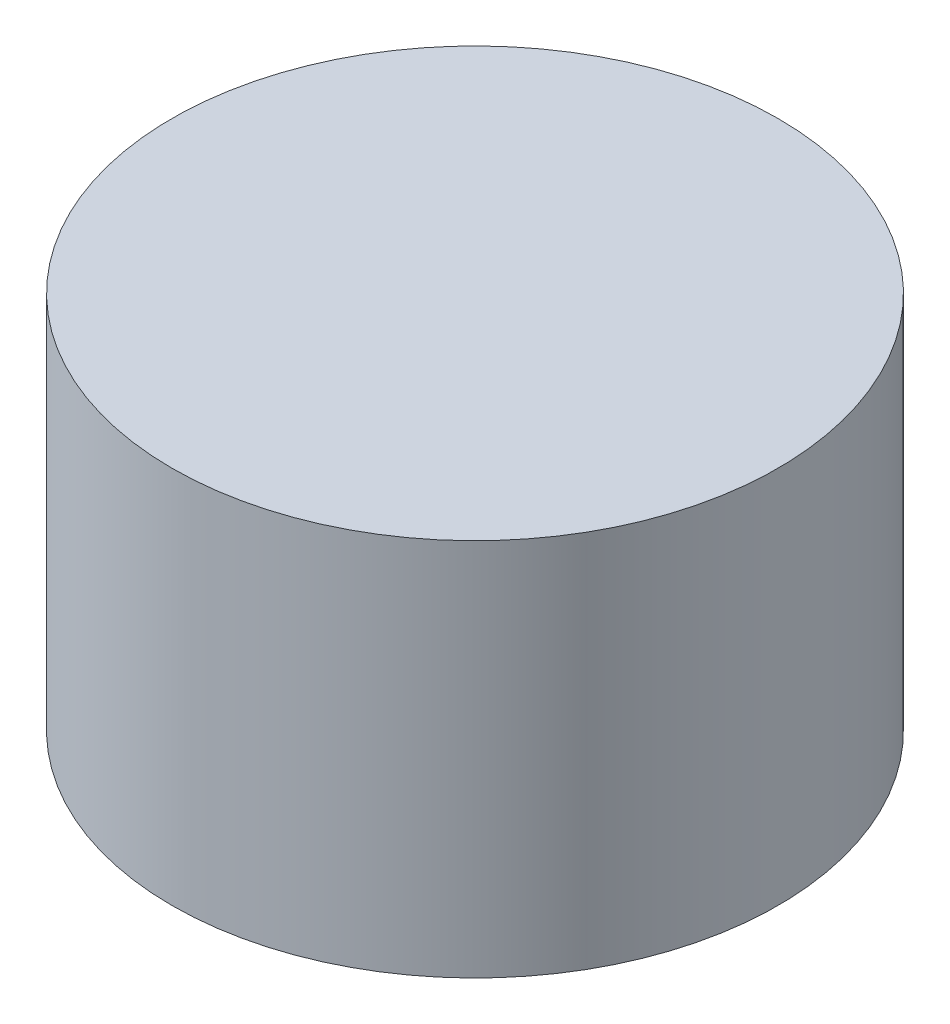
ISO-10303-21;
HEADER;
FILE_DESCRIPTION(('STEP AP214'),'2;1');
FILE_NAME('part.step','',(''),(''),'','','');
FILE_SCHEMA(('AUTOMOTIVE_DESIGN { 1 0 10303 214 1 1 1 1 }'));
ENDSEC;
DATA;
#1=APPLICATION_CONTEXT('core data for automotive mechanical design processes');
#2=APPLICATION_PROTOCOL_DEFINITION('international standard','automotive_design',2000,#1);
#3=PRODUCT_CONTEXT('',#1,'mechanical');
#4=PRODUCT('Part','Part','',(#3));
#5=PRODUCT_RELATED_PRODUCT_CATEGORY('part','',(#4));
#6=PRODUCT_DEFINITION_FORMATION('','',#4);
#7=PRODUCT_DEFINITION_CONTEXT('part definition',#1,'design');
#8=PRODUCT_DEFINITION('design','',#6,#7);
#9=PRODUCT_DEFINITION_SHAPE('','',#8);
#10=(LENGTH_UNIT() NAMED_UNIT(*) SI_UNIT(.MILLI.,.METRE.));
#11=(NAMED_UNIT(*) PLANE_ANGLE_UNIT() SI_UNIT($,.RADIAN.));
#12=(NAMED_UNIT(*) SI_UNIT($,.STERADIAN.) SOLID_ANGLE_UNIT());
#13=UNCERTAINTY_MEASURE_WITH_UNIT(LENGTH_MEASURE(1.E-05),#10,'distance_accuracy_value','');
#14=(GEOMETRIC_REPRESENTATION_CONTEXT(3) GLOBAL_UNCERTAINTY_ASSIGNED_CONTEXT((#13)) GLOBAL_UNIT_ASSIGNED_CONTEXT((#10,
#11,#12)) REPRESENTATION_CONTEXT('',''));
#15=CARTESIAN_POINT('',(0.,0.,0.));
#16=DIRECTION('',(0.,0.,1.));
#17=DIRECTION('',(1.,0.,0.));
#18=AXIS2_PLACEMENT_3D('',#15,#16,#17);
#19=CARTESIAN_POINT('',(0.,25.4,0.));
#20=DIRECTION('',(0.,-1.,0.));
#21=DIRECTION('',(0.,0.,-1.));
#22=AXIS2_PLACEMENT_3D('',#19,#20,#21);
#23=CYLINDRICAL_SURFACE('',#22,20.32);
#24=CARTESIAN_POINT('',(0.,25.4,0.));
#25=DIRECTION('',(0.,1.,0.));
#26=DIRECTION('',(0.,0.,1.));
#27=AXIS2_PLACEMENT_3D('',#24,#25,#26);
#28=CIRCLE('',#27,20.32);
#29=CARTESIAN_POINT('',(0.,25.4,20.32));
#30=VERTEX_POINT('',#29);
#31=EDGE_CURVE('E10',#30,#30,#28,.T.);
#32=ORIENTED_EDGE('',*,*,#31,.F.);
#33=EDGE_LOOP('',(#32));
#34=FACE_BOUND('',#33,.T.);
#35=CARTESIAN_POINT('',(0.,0.,0.));
#36=DIRECTION('',(0.,1.,0.));
#37=DIRECTION('',(0.,0.,1.));
#38=AXIS2_PLACEMENT_3D('',#35,#36,#37);
#39=CIRCLE('',#38,20.32);
#40=CARTESIAN_POINT('',(0.,0.,20.32));
#41=VERTEX_POINT('',#40);
#42=EDGE_CURVE('E40',#41,#41,#39,.T.);
#43=ORIENTED_EDGE('',*,*,#42,.T.);
#44=EDGE_LOOP('',(#43));
#45=FACE_BOUND('',#44,.T.);
#46=ADVANCED_FACE('F37',(#34,#45),#23,.T.);
#47=CARTESIAN_POINT('',(0.,25.4,0.));
#48=DIRECTION('',(0.,1.,0.));
#49=DIRECTION('',(0.,0.,1.));
#50=AXIS2_PLACEMENT_3D('',#47,#48,#49);
#51=PLANE('',#50);
#52=ORIENTED_EDGE('',*,*,#31,.T.);
#53=EDGE_LOOP('',(#52));
#54=FACE_BOUND('',#53,.T.);
#55=ADVANCED_FACE('F70',(#54),#51,.T.);
#56=CARTESIAN_POINT('',(0.,0.,0.));
#57=DIRECTION('',(0.,1.,0.));
#58=DIRECTION('',(0.,0.,1.));
#59=AXIS2_PLACEMENT_3D('',#56,#57,#58);
#60=PLANE('',#59);
#61=CARTESIAN_POINT('',(0.,0.,0.));
#62=DIRECTION('',(0.,-1.,0.));
#63=DIRECTION('',(0.,0.,-1.));
#64=AXIS2_PLACEMENT_3D('',#61,#62,#63);
#65=CIRCLE('',#64,16.51);
#66=CARTESIAN_POINT('',(0.,0.,-16.51));
#67=VERTEX_POINT('',#66);
#68=EDGE_CURVE('E51',#67,#67,#65,.T.);
#69=ORIENTED_EDGE('',*,*,#68,.F.);
#70=EDGE_LOOP('',(#69));
#71=FACE_BOUND('',#70,.T.);
#72=ORIENTED_EDGE('',*,*,#42,.F.);
#73=EDGE_LOOP('',(#72));
#74=FACE_BOUND('',#73,.T.);
#75=ADVANCED_FACE('F64',(#71,#74),#60,.F.);
#76=CARTESIAN_POINT('',(0.,15.24,0.));
#77=DIRECTION('',(0.,-1.,0.));
#78=DIRECTION('',(0.,0.,-1.));
#79=AXIS2_PLACEMENT_3D('',#76,#77,#78);
#80=CYLINDRICAL_SURFACE('',#79,16.51);
#81=CARTESIAN_POINT('',(0.,15.24,0.));
#82=DIRECTION('',(0.,-1.,0.));
#83=DIRECTION('',(0.,0.,-1.));
#84=AXIS2_PLACEMENT_3D('',#81,#82,#83);
#85=CIRCLE('',#84,16.51);
#86=CARTESIAN_POINT('',(0.,15.24,-16.51));
#87=VERTEX_POINT('',#86);
#88=EDGE_CURVE('E49',#87,#87,#85,.T.);
#89=CARTESIAN_POINT('',(0.,15.24,-16.51));
#90=CARTESIAN_POINT('',(0.,15.08125,-16.51));
#91=CARTESIAN_POINT('',(0.,14.9225,-16.51));
#92=CARTESIAN_POINT('',(0.,14.605,-16.51));
#93=CARTESIAN_POINT('',(0.,14.44625,-16.51));
#94=CARTESIAN_POINT('',(0.,14.12875,-16.51));
#95=CARTESIAN_POINT('',(0.,13.97,-16.51));
#96=CARTESIAN_POINT('',(0.,13.6525,-16.51));
#97=CARTESIAN_POINT('',(0.,13.49375,-16.51));
#98=CARTESIAN_POINT('',(0.,13.17625,-16.51));
#99=CARTESIAN_POINT('',(0.,13.0175,-16.51));
#100=CARTESIAN_POINT('',(0.,12.7,-16.51));
#101=CARTESIAN_POINT('',(0.,12.54125,-16.51));
#102=CARTESIAN_POINT('',(0.,12.22375,-16.51));
#103=CARTESIAN_POINT('',(0.,12.065,-16.51));
#104=CARTESIAN_POINT('',(0.,11.7475,-16.51));
#105=CARTESIAN_POINT('',(0.,11.58875,-16.51));
#106=CARTESIAN_POINT('',(0.,11.27125,-16.51));
#107=CARTESIAN_POINT('',(0.,11.1125,-16.51));
#108=CARTESIAN_POINT('',(0.,10.795,-16.51));
#109=CARTESIAN_POINT('',(0.,10.63625,-16.51));
#110=CARTESIAN_POINT('',(0.,10.31875,-16.51));
#111=CARTESIAN_POINT('',(0.,10.16,-16.51));
#112=CARTESIAN_POINT('',(0.,9.8425,-16.51));
#113=CARTESIAN_POINT('',(0.,9.68375,-16.51));
#114=CARTESIAN_POINT('',(0.,9.36625,-16.51));
#115=CARTESIAN_POINT('',(0.,9.2075,-16.51));
#116=CARTESIAN_POINT('',(0.,8.89,-16.51));
#117=CARTESIAN_POINT('',(0.,8.73125,-16.51));
#118=CARTESIAN_POINT('',(0.,8.41375,-16.51));
#119=CARTESIAN_POINT('',(0.,8.255,-16.51));
#120=CARTESIAN_POINT('',(0.,7.9375,-16.51));
#121=CARTESIAN_POINT('',(0.,7.77875,-16.51));
#122=CARTESIAN_POINT('',(0.,7.46125,-16.51));
#123=CARTESIAN_POINT('',(0.,7.3025,-16.51));
#124=CARTESIAN_POINT('',(0.,6.985,-16.51));
#125=CARTESIAN_POINT('',(0.,6.82625,-16.51));
#126=CARTESIAN_POINT('',(0.,6.50875,-16.51));
#127=CARTESIAN_POINT('',(0.,6.35,-16.51));
#128=CARTESIAN_POINT('',(0.,6.0325,-16.51));
#129=CARTESIAN_POINT('',(0.,5.87375,-16.51));
#130=CARTESIAN_POINT('',(0.,5.55625,-16.51));
#131=CARTESIAN_POINT('',(0.,5.3975,-16.51));
#132=CARTESIAN_POINT('',(0.,5.08,-16.51));
#133=CARTESIAN_POINT('',(0.,4.92125,-16.51));
#134=CARTESIAN_POINT('',(0.,4.60375,-16.51));
#135=CARTESIAN_POINT('',(0.,4.445,-16.51));
#136=CARTESIAN_POINT('',(0.,4.1275,-16.51));
#137=CARTESIAN_POINT('',(0.,3.96875,-16.51));
#138=CARTESIAN_POINT('',(0.,3.65125,-16.51));
#139=CARTESIAN_POINT('',(0.,3.4925,-16.51));
#140=CARTESIAN_POINT('',(0.,3.175,-16.51));
#141=CARTESIAN_POINT('',(0.,3.01625,-16.51));
#142=CARTESIAN_POINT('',(0.,2.69875,-16.51));
#143=CARTESIAN_POINT('',(0.,2.54,-16.51));
#144=CARTESIAN_POINT('',(0.,2.2225,-16.51));
#145=CARTESIAN_POINT('',(0.,2.06375,-16.51));
#146=CARTESIAN_POINT('',(0.,1.74625,-16.51));
#147=CARTESIAN_POINT('',(0.,1.5875,-16.51));
#148=CARTESIAN_POINT('',(0.,1.27,-16.51));
#149=CARTESIAN_POINT('',(0.,1.11125,-16.51));
#150=CARTESIAN_POINT('',(0.,0.79375,-16.51));
#151=CARTESIAN_POINT('',(0.,0.634999999999999,-16.51));
#152=CARTESIAN_POINT('',(0.,0.3175,-16.51));
#153=CARTESIAN_POINT('',(0.,0.15875,-16.51));
#154=CARTESIAN_POINT('',(0.,0.,-16.51));
#155=B_SPLINE_CURVE_WITH_KNOTS('',3,(#89,#90,#91,#92,#93,#94,#95,#96,#97,#98,#99,#100,#101,#102,
#103,#104,#105,#106,#107,#108,#109,#110,#111,#112,#113,#114,#115,#116,#117,#118,#119,#120,#121,
#122,#123,#124,#125,#126,#127,#128,#129,#130,#131,#132,#133,#134,#135,#136,#137,#138,#139,#140,
#141,#142,#143,#144,#145,#146,#147,#148,#149,#150,#151,#152,#153,#154),.UNSPECIFIED.,.F.,.F.,(4,
2,2,2,2,2,2,2,2,2,2,2,2,2,2,2,2,2,2,2,2,2,2,2,2,2,2,2,2,2,2,2,4),(0.,0.476249999999999,
0.952499999999998,1.42875,1.905,2.38125,2.8575,3.33375,3.81,4.28625,4.7625,5.23875,5.715,
6.19125,6.6675,7.14375,7.62,8.09625,8.5725,9.04875,9.525,10.00125,10.4775,10.95375,11.43,
11.90625,12.3825,12.85875,13.335,13.81125,14.2875,14.76375,15.24),.UNSPECIFIED.);
#156=EDGE_CURVE('BSEAM61',#87,#67,#155,.T.);
#157=ORIENTED_EDGE('',*,*,#88,.F.);
#158=ORIENTED_EDGE('',*,*,#68,.T.);
#159=ORIENTED_EDGE('',*,*,#156,.T.);
#160=ORIENTED_EDGE('',*,*,#156,.F.);
#161=EDGE_LOOP('',(#157,#159,#158,#160));
#162=FACE_BOUND('',#161,.T.);
#163=ADVANCED_FACE('F61',(#162),#80,.F.);
#164=CARTESIAN_POINT('',(0.,15.24,0.));
#165=DIRECTION('',(0.,-1.,0.));
#166=DIRECTION('',(0.,0.,-1.));
#167=AXIS2_PLACEMENT_3D('',#164,#165,#166);
#168=PLANE('',#167);
#169=ORIENTED_EDGE('',*,*,#88,.T.);
#170=EDGE_LOOP('',(#169));
#171=FACE_BOUND('',#170,.T.);
#172=ADVANCED_FACE('F59',(#171),#168,.T.);
#173=CLOSED_SHELL('',(#46,#55,#75,#163,#172));
#174=MANIFOLD_SOLID_BREP('B2',#173);
#175=ADVANCED_BREP_SHAPE_REPRESENTATION('',(#18,#174),#14);
#176=SHAPE_DEFINITION_REPRESENTATION(#9,#175);
ENDSEC;
END-ISO-10303-21;
